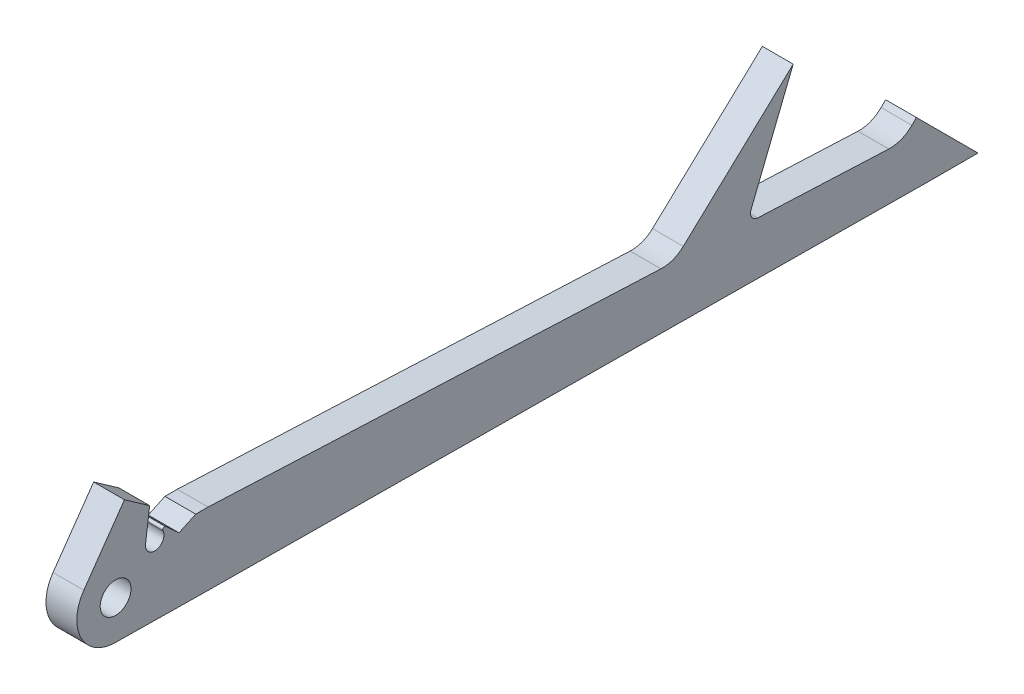
ISO-10303-21;
HEADER;
FILE_DESCRIPTION(('STEP AP214'),'2;1');
FILE_NAME('part.step','',(''),(''),'','','');
FILE_SCHEMA(('AUTOMOTIVE_DESIGN { 1 0 10303 214 1 1 1 1 }'));
ENDSEC;
DATA;
#1=APPLICATION_CONTEXT('core data for automotive mechanical design processes');
#2=APPLICATION_PROTOCOL_DEFINITION('international standard','automotive_design',2000,#1);
#3=PRODUCT_CONTEXT('',#1,'mechanical');
#4=PRODUCT('Part','Part','',(#3));
#5=PRODUCT_RELATED_PRODUCT_CATEGORY('part','',(#4));
#6=PRODUCT_DEFINITION_FORMATION('','',#4);
#7=PRODUCT_DEFINITION_CONTEXT('part definition',#1,'design');
#8=PRODUCT_DEFINITION('design','',#6,#7);
#9=PRODUCT_DEFINITION_SHAPE('','',#8);
#10=(LENGTH_UNIT() NAMED_UNIT(*) SI_UNIT(.MILLI.,.METRE.));
#11=(NAMED_UNIT(*) PLANE_ANGLE_UNIT() SI_UNIT($,.RADIAN.));
#12=(NAMED_UNIT(*) SI_UNIT($,.STERADIAN.) SOLID_ANGLE_UNIT());
#13=UNCERTAINTY_MEASURE_WITH_UNIT(LENGTH_MEASURE(1.E-05),#10,'distance_accuracy_value','');
#14=(GEOMETRIC_REPRESENTATION_CONTEXT(3) GLOBAL_UNCERTAINTY_ASSIGNED_CONTEXT((#13)) GLOBAL_UNIT_ASSIGNED_CONTEXT((#10,
#11,#12)) REPRESENTATION_CONTEXT('',''));
#15=CARTESIAN_POINT('',(0.,0.,0.));
#16=DIRECTION('',(0.,0.,1.));
#17=DIRECTION('',(1.,0.,0.));
#18=AXIS2_PLACEMENT_3D('',#15,#16,#17);
#19=CARTESIAN_POINT('',(-165.92089508835,16.1650258056597,-195.52164647412));
#20=DIRECTION('',(0.,0.999011487799349,-0.0444527529510865));
#21=DIRECTION('',(0.,0.0444527529510865,0.99901148779935));
#22=AXIS2_PLACEMENT_3D('',#19,#20,#21);
#23=PLANE('',#22);
#24=DIRECTION('',(0.,0.0444527529510865,0.99901148779935));
#25=VECTOR('',#24,1.);
#26=CARTESIAN_POINT('',(6.35,16.1650258056597,-195.52164647412));
#27=LINE('',#26,#25);
#28=CARTESIAN_POINT('',(6.35,12.0102324927861,-288.894631799908));
#29=VERTEX_POINT('',#28);
#30=CARTESIAN_POINT('',(6.35,16.1650258056597,-195.52164647412));
#31=VERTEX_POINT('',#30);
#32=EDGE_CURVE('E271',#29,#31,#27,.T.);
#33=ORIENTED_EDGE('',*,*,#32,.F.);
#34=DIRECTION('',(1.,0.,0.));
#35=VECTOR('',#34,1.);
#36=CARTESIAN_POINT('',(0.,12.0102324927861,-288.894631799908));
#37=LINE('',#36,#35);
#38=CARTESIAN_POINT('',(0.,12.0102324927861,-288.894631799908));
#39=VERTEX_POINT('',#38);
#40=EDGE_CURVE('E344',#29,#39,#37,.F.);
#41=ORIENTED_EDGE('',*,*,#40,.T.);
#42=DIRECTION('',(0.,-0.0444527529510865,-0.99901148779935));
#43=VECTOR('',#42,1.);
#44=CARTESIAN_POINT('',(0.,16.1650258056597,-195.52164647412));
#45=LINE('',#44,#43);
#46=CARTESIAN_POINT('',(0.,16.1650258056597,-195.52164647412));
#47=VERTEX_POINT('',#46);
#48=EDGE_CURVE('E226',#47,#39,#45,.T.);
#49=ORIENTED_EDGE('',*,*,#48,.F.);
#50=DIRECTION('',(-1.,0.,0.));
#51=VECTOR('',#50,1.);
#52=CARTESIAN_POINT('',(6.35,16.1650258056597,-195.52164647412));
#53=LINE('',#52,#51);
#54=EDGE_CURVE('E324',#31,#47,#53,.T.);
#55=ORIENTED_EDGE('',*,*,#54,.F.);
#56=EDGE_LOOP('',(#33,#41,#49,#55));
#57=FACE_BOUND('',#56,.T.);
#58=ADVANCED_FACE('F41',(#57),#23,.T.);
#59=CARTESIAN_POINT('',(6.35,9.525,-176.47164647412));
#60=DIRECTION('',(1.,0.,0.));
#61=DIRECTION('',(0.,0.,-1.));
#62=AXIS2_PLACEMENT_3D('',#59,#60,#61);
#63=PLANE('',#62);
#64=DIRECTION('',(0.,0.675997213115544,0.736904178207735));
#65=VECTOR('',#64,1.);
#66=CARTESIAN_POINT('',(6.35,14.554850228429,-189.540378321137));
#67=LINE('',#66,#65);
#68=CARTESIAN_POINT('',(6.35,14.554850228429,-189.540378321137));
#69=VERTEX_POINT('',#68);
#70=CARTESIAN_POINT('',(6.35,17.0473052344062,-186.823354534258));
#71=VERTEX_POINT('',#70);
#72=EDGE_CURVE('E290',#69,#71,#67,.T.);
#73=ORIENTED_EDGE('',*,*,#72,.T.);
#74=CARTESIAN_POINT('',(6.35,16.766544742509,-186.565799596061));
#75=DIRECTION('',(1.,0.,0.));
#76=DIRECTION('',(0.,0.,-1.));
#77=AXIS2_PLACEMENT_3D('',#74,#75,#76);
#78=CIRCLE('',#77,0.381);
#79=CARTESIAN_POINT('',(6.35,16.6212011416771,-186.213611808514));
#80=VERTEX_POINT('',#79);
#81=EDGE_CURVE('E338',#71,#80,#78,.T.);
#82=ORIENTED_EDGE('',*,*,#81,.T.);
#83=DIRECTION('',(0.,-0.924377395136311,-0.381479267275442));
#84=VECTOR('',#83,1.);
#85=CARTESIAN_POINT('',(6.35,18.2069999283971,-185.559172006775));
#86=LINE('',#85,#84);
#87=CARTESIAN_POINT('',(6.35,16.4460609906625,-186.285890010935));
#88=VERTEX_POINT('',#87);
#89=EDGE_CURVE('E293',#80,#88,#86,.T.);
#90=ORIENTED_EDGE('',*,*,#89,.T.);
#91=CARTESIAN_POINT('',(6.35,15.7193429865027,-184.524951073201));
#92=DIRECTION('',(-1.,0.,0.));
#93=DIRECTION('',(0.,0.,1.));
#94=AXIS2_PLACEMENT_3D('',#91,#92,#93);
#95=CIRCLE('',#94,1.90499999999998);
#96=CARTESIAN_POINT('',(6.35,15.9704562023801,-182.636574216529));
#97=VERTEX_POINT('',#96);
#98=EDGE_CURVE('E295',#88,#97,#95,.T.);
#99=ORIENTED_EDGE('',*,*,#98,.T.);
#100=DIRECTION('',(0.,0.991273940509858,-0.131817961090505));
#101=VECTOR('',#100,1.);
#102=CARTESIAN_POINT('',(6.35,15.9704562023801,-182.636574216529));
#103=LINE('',#102,#101);
#104=CARTESIAN_POINT('',(6.35,22.4356903032563,-183.496310301906));
#105=VERTEX_POINT('',#104);
#106=EDGE_CURVE('E297',#97,#105,#103,.T.);
#107=ORIENTED_EDGE('',*,*,#106,.T.);
#108=DIRECTION('',(0.,0.573576436351047,0.819152044288991));
#109=VECTOR('',#108,1.);
#110=CARTESIAN_POINT('',(6.35,26.0779006740854,-178.294694820671));
#111=LINE('',#110,#109);
#112=CARTESIAN_POINT('',(6.35,26.0779006740854,-178.294694820671));
#113=VERTEX_POINT('',#112);
#114=EDGE_CURVE('E299',#105,#113,#111,.T.);
#115=ORIENTED_EDGE('',*,*,#114,.T.);
#116=DIRECTION('',(0.,-0.819152044288991,0.573576436351048));
#117=VECTOR('',#116,1.);
#118=CARTESIAN_POINT('',(6.35,14.1141850672447,-169.917610967764));
#119=LINE('',#118,#117);
#120=CARTESIAN_POINT('',(6.35,14.1141850672447,-169.917610967764));
#121=VERTEX_POINT('',#120);
#122=EDGE_CURVE('E301',#113,#121,#119,.T.);
#123=ORIENTED_EDGE('',*,*,#122,.T.);
#124=CARTESIAN_POINT('',(6.35,9.525,-176.47164647412));
#125=DIRECTION('',(1.,0.,0.));
#126=DIRECTION('',(0.,0.,-1.));
#127=AXIS2_PLACEMENT_3D('',#124,#125,#126);
#128=CIRCLE('',#127,8.00100000000001);
#129=CARTESIAN_POINT('',(6.35,1.52470715135464,-176.365272906379));
#130=VERTEX_POINT('',#129);
#131=EDGE_CURVE('E281',#121,#130,#128,.T.);
#132=ORIENTED_EDGE('',*,*,#131,.T.);
#133=DIRECTION('',(0.,-0.0132950340883751,-0.999911617128528));
#134=VECTOR('',#133,1.);
#135=CARTESIAN_POINT('',(6.35,1.27000000001228,-195.521646474134));
#136=LINE('',#135,#134);
#137=CARTESIAN_POINT('',(6.35,1.27000000001228,-195.521646474134));
#138=VERTEX_POINT('',#137);
#139=EDGE_CURVE('E284',#130,#138,#136,.T.);
#140=ORIENTED_EDGE('',*,*,#139,.T.);
#141=DIRECTION('',(0.,-0.00851033009774635,-0.999963786485104));
#142=VECTOR('',#141,1.);
#143=CARTESIAN_POINT('',(6.35,1.27000000001228,-195.521646474134));
#144=LINE('',#143,#142);
#145=CARTESIAN_POINT('',(6.35,1.22755538373154E-11,-344.74664647412));
#146=VERTEX_POINT('',#145);
#147=EDGE_CURVE('E263',#138,#146,#144,.T.);
#148=ORIENTED_EDGE('',*,*,#147,.T.);
#149=DIRECTION('',(0.,0.,-1.));
#150=VECTOR('',#149,1.);
#151=CARTESIAN_POINT('',(6.35,1.22755538373154E-11,-344.74664647412));
#152=LINE('',#151,#150);
#153=CARTESIAN_POINT('',(6.35,1.22755538373154E-11,-354.27164647412));
#154=VERTEX_POINT('',#153);
#155=EDGE_CURVE('E266',#146,#154,#152,.T.);
#156=ORIENTED_EDGE('',*,*,#155,.T.);
#157=DIRECTION('',(0.,0.707106781186547,0.707106781186548));
#158=VECTOR('',#157,1.);
#159=CARTESIAN_POINT('',(6.35,9.52500000001227,-344.74664647412));
#160=LINE('',#159,#158);
#161=CARTESIAN_POINT('',(6.35,12.7000000000123,-341.57164647412));
#162=VERTEX_POINT('',#161);
#163=EDGE_CURVE('E269',#154,#162,#160,.T.);
#164=ORIENTED_EDGE('',*,*,#163,.T.);
#165=DIRECTION('',(0.,-0.707106781186549,0.707106781186546));
#166=VECTOR('',#165,1.);
#167=CARTESIAN_POINT('',(6.35,12.7000000000123,-341.57164647412));
#168=LINE('',#167,#166);
#169=CARTESIAN_POINT('',(6.35,11.7734565631059,-340.645103037214));
#170=VERTEX_POINT('',#169);
#171=EDGE_CURVE('E212',#162,#170,#168,.T.);
#172=ORIENTED_EDGE('',*,*,#171,.T.);
#173=CARTESIAN_POINT('',(6.35,16.2635846236405,-336.15497497668));
#174=DIRECTION('',(1.,0.,0.));
#175=DIRECTION('',(0.,0.,-1.));
#176=AXIS2_PLACEMENT_3D('',#173,#174,#175);
#177=CIRCLE('',#176,6.35);
#178=CARTESIAN_POINT('',(6.35,9.91986167611461,-335.87269999544));
#179=VERTEX_POINT('',#178);
#180=EDGE_CURVE('E355',#170,#179,#177,.F.);
#181=ORIENTED_EDGE('',*,*,#180,.T.);
#182=CARTESIAN_POINT('',(6.35,11.1207621842455,-308.884193689724));
#183=VERTEX_POINT('',#182);
#184=EDGE_CURVE('E272',#179,#183,#27,.T.);
#185=ORIENTED_EDGE('',*,*,#184,.T.);
#186=CARTESIAN_POINT('',(6.34999999999999,12.706692921127,-308.954762435033));
#187=DIRECTION('',(1.,0.,0.));
#188=DIRECTION('',(0.,0.,-1.));
#189=AXIS2_PLACEMENT_3D('',#186,#187,#188);
#190=CIRCLE('',#189,1.5875);
#191=CARTESIAN_POINT('',(6.35,13.2985853757295,-307.481731691232));
#192=VERTEX_POINT('',#191);
#193=EDGE_CURVE('E49',#183,#192,#190,.F.);
#194=ORIENTED_EDGE('',*,*,#193,.T.);
#195=DIRECTION('',(0.,0.927893381922255,-0.372845640694484));
#196=VECTOR('',#195,1.);
#197=CARTESIAN_POINT('',(6.35,11.2203257376244,-306.64664647412));
#198=LINE('',#197,#196);
#199=CARTESIAN_POINT('',(6.35,34.925,-316.17164647412));
#200=VERTEX_POINT('',#199);
#201=EDGE_CURVE('E211',#192,#200,#198,.T.);
#202=ORIENTED_EDGE('',*,*,#201,.T.);
#203=DIRECTION('',(0.,-0.683385621008016,0.730057595672758));
#204=VECTOR('',#203,1.);
#205=CARTESIAN_POINT('',(6.35,34.925,-316.17164647412));
#206=LINE('',#205,#204);
#207=CARTESIAN_POINT('',(6.35,13.7180897077899,-293.516405474548));
#208=VERTEX_POINT('',#207);
#209=EDGE_CURVE('E205',#200,#208,#206,.T.);
#210=ORIENTED_EDGE('',*,*,#209,.T.);
#211=CARTESIAN_POINT('',(6.35,18.3539554403119,-289.176906781148));
#212=DIRECTION('',(1.,0.,0.));
#213=DIRECTION('',(0.,0.,-1.));
#214=AXIS2_PLACEMENT_3D('',#211,#212,#213);
#215=CIRCLE('',#214,6.35);
#216=EDGE_CURVE('E352',#208,#29,#215,.F.);
#217=ORIENTED_EDGE('',*,*,#216,.T.);
#218=ORIENTED_EDGE('',*,*,#32,.T.);
#219=DIRECTION('',(0.,5.50284273886857E-13,1.));
#220=VECTOR('',#219,1.);
#221=CARTESIAN_POINT('',(6.35,16.1650258056611,-192.993410989747));
#222=LINE('',#221,#220);
#223=CARTESIAN_POINT('',(6.35,16.1650258056611,-192.993410989747));
#224=VERTEX_POINT('',#223);
#225=EDGE_CURVE('E286',#31,#224,#222,.T.);
#226=ORIENTED_EDGE('',*,*,#225,.T.);
#227=DIRECTION('',(0.,-0.422618261740698,0.90630778703665));
#228=VECTOR('',#227,1.);
#229=CARTESIAN_POINT('',(6.35,14.8232128246343,-190.115883765906));
#230=LINE('',#229,#228);
#231=EDGE_CURVE('E288',#224,#69,#230,.T.);
#232=ORIENTED_EDGE('',*,*,#231,.T.);
#233=EDGE_LOOP('',(#73,#82,#90,#99,#107,#115,#123,#132,#140,#148,#156,#164,#172,#181,#185,#194,
#202,#210,#217,#218,#226,#232));
#234=FACE_BOUND('',#233,.T.);
#235=CARTESIAN_POINT('',(6.35,9.525,-176.47164647412));
#236=DIRECTION('',(1.,0.,0.));
#237=DIRECTION('',(0.,0.,-1.));
#238=AXIS2_PLACEMENT_3D('',#235,#236,#237);
#239=CIRCLE('',#238,3.17499999999995);
#240=CARTESIAN_POINT('',(6.35,9.525,-179.64664647412));
#241=VERTEX_POINT('',#240);
#242=EDGE_CURVE('E277',#241,#241,#239,.T.);
#243=ORIENTED_EDGE('',*,*,#242,.F.);
#244=EDGE_LOOP('',(#243));
#245=FACE_BOUND('',#244,.T.);
#246=ADVANCED_FACE('F369',(#234,#245),#63,.T.);
#247=CARTESIAN_POINT('',(6.35,9.525,-176.47164647412));
#248=DIRECTION('',(-1.,0.,0.));
#249=DIRECTION('',(0.,0.,1.));
#250=AXIS2_PLACEMENT_3D('',#247,#248,#249);
#251=CYLINDRICAL_SURFACE('',#250,8.00100000000001);
#252=DIRECTION('',(-1.,0.,0.));
#253=VECTOR('',#252,1.);
#254=CARTESIAN_POINT('',(6.35,14.1141850672447,-169.917610967764));
#255=LINE('',#254,#253);
#256=CARTESIAN_POINT('',(0.,14.1141850672447,-169.917610967764));
#257=VERTEX_POINT('',#256);
#258=EDGE_CURVE('E303',#121,#257,#255,.T.);
#259=ORIENTED_EDGE('',*,*,#258,.T.);
#260=CARTESIAN_POINT('',(0.,9.525,-176.47164647412));
#261=DIRECTION('',(1.,0.,0.));
#262=DIRECTION('',(0.,0.,-1.));
#263=AXIS2_PLACEMENT_3D('',#260,#261,#262);
#264=CIRCLE('',#263,8.00100000000001);
#265=CARTESIAN_POINT('',(0.,1.52470715135464,-176.365272906379));
#266=VERTEX_POINT('',#265);
#267=EDGE_CURVE('E234',#257,#266,#264,.T.);
#268=ORIENTED_EDGE('',*,*,#267,.T.);
#269=DIRECTION('',(-1.,0.,0.));
#270=VECTOR('',#269,1.);
#271=CARTESIAN_POINT('',(6.35,1.52470715135464,-176.365272906379));
#272=LINE('',#271,#270);
#273=EDGE_CURVE('E330',#130,#266,#272,.T.);
#274=ORIENTED_EDGE('',*,*,#273,.F.);
#275=ORIENTED_EDGE('',*,*,#131,.F.);
#276=EDGE_LOOP('',(#259,#268,#274,#275));
#277=FACE_BOUND('',#276,.T.);
#278=ADVANCED_FACE('F399',(#277),#251,.T.);
#279=CARTESIAN_POINT('',(6.35,1.27000000001228,-195.521646474134));
#280=DIRECTION('',(0.,0.999911617128528,-0.0132950340883751));
#281=DIRECTION('',(0.,0.0132950340883751,0.999911617128528));
#282=AXIS2_PLACEMENT_3D('',#279,#280,#281);
#283=PLANE('',#282);
#284=ORIENTED_EDGE('',*,*,#273,.T.);
#285=DIRECTION('',(0.,-0.0132950340883751,-0.999911617128528));
#286=VECTOR('',#285,1.);
#287=CARTESIAN_POINT('',(0.,1.27000000001228,-195.521646474134));
#288=LINE('',#287,#286);
#289=CARTESIAN_POINT('',(0.,1.27000000001228,-195.521646474134));
#290=VERTEX_POINT('',#289);
#291=EDGE_CURVE('E231',#266,#290,#288,.T.);
#292=ORIENTED_EDGE('',*,*,#291,.T.);
#293=DIRECTION('',(-1.,0.,0.));
#294=VECTOR('',#293,1.);
#295=CARTESIAN_POINT('',(6.35,1.27000000001228,-195.521646474134));
#296=LINE('',#295,#294);
#297=EDGE_CURVE('E327',#138,#290,#296,.T.);
#298=ORIENTED_EDGE('',*,*,#297,.F.);
#299=ORIENTED_EDGE('',*,*,#139,.F.);
#300=EDGE_LOOP('',(#284,#292,#298,#299));
#301=FACE_BOUND('',#300,.T.);
#302=ADVANCED_FACE('F396',(#301),#283,.F.);
#303=CARTESIAN_POINT('',(6.35,16.1650258056611,-192.993410989747));
#304=DIRECTION('',(0.,-1.,5.50284273886857E-13));
#305=DIRECTION('',(0.,-5.50284273886857E-13,-1.));
#306=AXIS2_PLACEMENT_3D('',#303,#304,#305);
#307=PLANE('',#306);
#308=ORIENTED_EDGE('',*,*,#54,.T.);
#309=DIRECTION('',(0.,5.50284273886857E-13,1.));
#310=VECTOR('',#309,1.);
#311=CARTESIAN_POINT('',(0.,16.1650258056611,-192.993410989747));
#312=LINE('',#311,#310);
#313=CARTESIAN_POINT('',(0.,16.1650258056611,-192.993410989747));
#314=VERTEX_POINT('',#313);
#315=EDGE_CURVE('E228',#47,#314,#312,.T.);
#316=ORIENTED_EDGE('',*,*,#315,.T.);
#317=DIRECTION('',(-1.,0.,0.));
#318=VECTOR('',#317,1.);
#319=CARTESIAN_POINT('',(6.35,16.1650258056611,-192.993410989747));
#320=LINE('',#319,#318);
#321=EDGE_CURVE('E321',#224,#314,#320,.T.);
#322=ORIENTED_EDGE('',*,*,#321,.F.);
#323=ORIENTED_EDGE('',*,*,#225,.F.);
#324=EDGE_LOOP('',(#308,#316,#322,#323));
#325=FACE_BOUND('',#324,.T.);
#326=ADVANCED_FACE('F438',(#325),#307,.F.);
#327=CARTESIAN_POINT('',(6.35,14.554850228429,-189.540378321137));
#328=DIRECTION('',(0.,-0.906307787036655,-0.422618261740688));
#329=DIRECTION('',(0.,0.422618261740688,-0.906307787036655));
#330=AXIS2_PLACEMENT_3D('',#327,#328,#329);
#331=PLANE('',#330);
#332=ORIENTED_EDGE('',*,*,#321,.T.);
#333=DIRECTION('',(0.,-0.422618261740688,0.906307787036655));
#334=VECTOR('',#333,1.);
#335=CARTESIAN_POINT('',(0.,14.554850228429,-189.540378321137));
#336=LINE('',#335,#334);
#337=CARTESIAN_POINT('',(0.,14.554850228429,-189.540378321137));
#338=VERTEX_POINT('',#337);
#339=EDGE_CURVE('E252',#314,#338,#336,.T.);
#340=ORIENTED_EDGE('',*,*,#339,.T.);
#341=DIRECTION('',(-1.,0.,0.));
#342=VECTOR('',#341,1.);
#343=CARTESIAN_POINT('',(6.35,14.554850228429,-189.540378321137));
#344=LINE('',#343,#342);
#345=EDGE_CURVE('E318',#69,#338,#344,.T.);
#346=ORIENTED_EDGE('',*,*,#345,.F.);
#347=ORIENTED_EDGE('',*,*,#231,.F.);
#348=EDGE_LOOP('',(#332,#340,#346,#347));
#349=FACE_BOUND('',#348,.T.);
#350=ADVANCED_FACE('F435',(#349),#331,.F.);
#351=CARTESIAN_POINT('',(6.35,14.554850228429,-189.540378321137));
#352=DIRECTION('',(0.,-0.736904178207735,0.675997213115544));
#353=DIRECTION('',(0.,-0.675997213115544,-0.736904178207735));
#354=AXIS2_PLACEMENT_3D('',#351,#352,#353);
#355=PLANE('',#354);
#356=ORIENTED_EDGE('',*,*,#345,.T.);
#357=DIRECTION('',(0.,0.675997213115544,0.736904178207735));
#358=VECTOR('',#357,1.);
#359=CARTESIAN_POINT('',(0.,14.554850228429,-189.540378321137));
#360=LINE('',#359,#358);
#361=CARTESIAN_POINT('',(0.,17.0473052344062,-186.823354534258));
#362=VERTEX_POINT('',#361);
#363=EDGE_CURVE('E257',#338,#362,#360,.T.);
#364=ORIENTED_EDGE('',*,*,#363,.T.);
#365=DIRECTION('',(-1.,0.,0.));
#366=VECTOR('',#365,1.);
#367=CARTESIAN_POINT('',(6.35,17.0473052344062,-186.823354534258));
#368=LINE('',#367,#366);
#369=EDGE_CURVE('E336',#362,#71,#368,.F.);
#370=ORIENTED_EDGE('',*,*,#369,.T.);
#371=ORIENTED_EDGE('',*,*,#72,.F.);
#372=EDGE_LOOP('',(#356,#364,#370,#371));
#373=FACE_BOUND('',#372,.T.);
#374=ADVANCED_FACE('F429',(#373),#355,.F.);
#375=CARTESIAN_POINT('',(6.35,18.2069999283971,-185.559172006775));
#376=DIRECTION('',(0.,0.381479267275442,-0.924377395136311));
#377=DIRECTION('',(0.,0.924377395136311,0.381479267275442));
#378=AXIS2_PLACEMENT_3D('',#375,#376,#377);
#379=PLANE('',#378);
#380=DIRECTION('',(-1.,0.,0.));
#381=VECTOR('',#380,1.);
#382=CARTESIAN_POINT('',(6.35,16.6212011416771,-186.213611808514));
#383=LINE('',#382,#381);
#384=CARTESIAN_POINT('',(0.,16.6212011416771,-186.213611808514));
#385=VERTEX_POINT('',#384);
#386=EDGE_CURVE('E333',#80,#385,#383,.T.);
#387=ORIENTED_EDGE('',*,*,#386,.T.);
#388=DIRECTION('',(0.,-0.924377395136311,-0.381479267275442));
#389=VECTOR('',#388,1.);
#390=CARTESIAN_POINT('',(0.,18.2069999283971,-185.559172006775));
#391=LINE('',#390,#389);
#392=CARTESIAN_POINT('',(0.,16.4460609906625,-186.285890010935));
#393=VERTEX_POINT('',#392);
#394=EDGE_CURVE('E249',#385,#393,#391,.T.);
#395=ORIENTED_EDGE('',*,*,#394,.T.);
#396=DIRECTION('',(-1.,0.,0.));
#397=VECTOR('',#396,1.);
#398=CARTESIAN_POINT('',(6.35,16.4460609906625,-186.285890010935));
#399=LINE('',#398,#397);
#400=EDGE_CURVE('E315',#88,#393,#399,.T.);
#401=ORIENTED_EDGE('',*,*,#400,.F.);
#402=ORIENTED_EDGE('',*,*,#89,.F.);
#403=EDGE_LOOP('',(#387,#395,#401,#402));
#404=FACE_BOUND('',#403,.T.);
#405=ADVANCED_FACE('F420',(#404),#379,.F.);
#406=CARTESIAN_POINT('',(6.35,15.7193429865027,-184.524951073201));
#407=DIRECTION('',(-1.,0.,0.));
#408=DIRECTION('',(0.,0.,1.));
#409=AXIS2_PLACEMENT_3D('',#406,#407,#408);
#410=CYLINDRICAL_SURFACE('',#409,1.90499999999998);
#411=ORIENTED_EDGE('',*,*,#400,.T.);
#412=CARTESIAN_POINT('',(0.,15.7193429865027,-184.524951073201));
#413=DIRECTION('',(1.,0.,0.));
#414=DIRECTION('',(0.,0.,-1.));
#415=AXIS2_PLACEMENT_3D('',#412,#413,#414);
#416=CIRCLE('',#415,1.90499999999998);
#417=CARTESIAN_POINT('',(0.,15.9704562023801,-182.636574216529));
#418=VERTEX_POINT('',#417);
#419=EDGE_CURVE('E246',#393,#418,#416,.F.);
#420=ORIENTED_EDGE('',*,*,#419,.T.);
#421=DIRECTION('',(-1.,0.,0.));
#422=VECTOR('',#421,1.);
#423=CARTESIAN_POINT('',(6.35,15.9704562023801,-182.636574216529));
#424=LINE('',#423,#422);
#425=EDGE_CURVE('E312',#97,#418,#424,.T.);
#426=ORIENTED_EDGE('',*,*,#425,.F.);
#427=ORIENTED_EDGE('',*,*,#98,.F.);
#428=EDGE_LOOP('',(#411,#420,#426,#427));
#429=FACE_BOUND('',#428,.T.);
#430=ADVANCED_FACE('F415',(#429),#410,.F.);
#431=CARTESIAN_POINT('',(6.35,15.9704562023801,-182.636574216529));
#432=DIRECTION('',(0.,0.131817961090505,0.991273940509858));
#433=DIRECTION('',(0.,-0.991273940509858,0.131817961090505));
#434=AXIS2_PLACEMENT_3D('',#431,#432,#433);
#435=PLANE('',#434);
#436=ORIENTED_EDGE('',*,*,#425,.T.);
#437=DIRECTION('',(0.,0.991273940509858,-0.131817961090505));
#438=VECTOR('',#437,1.);
#439=CARTESIAN_POINT('',(0.,15.9704562023801,-182.636574216529));
#440=LINE('',#439,#438);
#441=CARTESIAN_POINT('',(0.,22.4356903032563,-183.496310301906));
#442=VERTEX_POINT('',#441);
#443=EDGE_CURVE('E243',#418,#442,#440,.T.);
#444=ORIENTED_EDGE('',*,*,#443,.T.);
#445=DIRECTION('',(-1.,0.,0.));
#446=VECTOR('',#445,1.);
#447=CARTESIAN_POINT('',(6.35,22.4356903032563,-183.496310301906));
#448=LINE('',#447,#446);
#449=EDGE_CURVE('E309',#105,#442,#448,.T.);
#450=ORIENTED_EDGE('',*,*,#449,.F.);
#451=ORIENTED_EDGE('',*,*,#106,.F.);
#452=EDGE_LOOP('',(#436,#444,#450,#451));
#453=FACE_BOUND('',#452,.T.);
#454=ADVANCED_FACE('F412',(#453),#435,.F.);
#455=CARTESIAN_POINT('',(6.35,26.0779006740854,-178.294694820671));
#456=DIRECTION('',(0.,-0.819152044288991,0.573576436351047));
#457=DIRECTION('',(0.,-0.573576436351047,-0.819152044288991));
#458=AXIS2_PLACEMENT_3D('',#455,#456,#457);
#459=PLANE('',#458);
#460=ORIENTED_EDGE('',*,*,#449,.T.);
#461=DIRECTION('',(0.,0.573576436351047,0.819152044288991));
#462=VECTOR('',#461,1.);
#463=CARTESIAN_POINT('',(0.,26.0779006740854,-178.294694820671));
#464=LINE('',#463,#462);
#465=CARTESIAN_POINT('',(0.,26.0779006740854,-178.294694820671));
#466=VERTEX_POINT('',#465);
#467=EDGE_CURVE('E240',#442,#466,#464,.T.);
#468=ORIENTED_EDGE('',*,*,#467,.T.);
#469=DIRECTION('',(-1.,0.,0.));
#470=VECTOR('',#469,1.);
#471=CARTESIAN_POINT('',(6.35,26.0779006740854,-178.294694820671));
#472=LINE('',#471,#470);
#473=EDGE_CURVE('E306',#113,#466,#472,.T.);
#474=ORIENTED_EDGE('',*,*,#473,.F.);
#475=ORIENTED_EDGE('',*,*,#114,.F.);
#476=EDGE_LOOP('',(#460,#468,#474,#475));
#477=FACE_BOUND('',#476,.T.);
#478=ADVANCED_FACE('F407',(#477),#459,.F.);
#479=CARTESIAN_POINT('',(6.35,14.1141850672447,-169.917610967764));
#480=DIRECTION('',(0.,-0.573576436351048,-0.819152044288991));
#481=DIRECTION('',(0.,0.819152044288991,-0.573576436351048));
#482=AXIS2_PLACEMENT_3D('',#479,#480,#481);
#483=PLANE('',#482);
#484=ORIENTED_EDGE('',*,*,#473,.T.);
#485=DIRECTION('',(0.,-0.819152044288991,0.573576436351048));
#486=VECTOR('',#485,1.);
#487=CARTESIAN_POINT('',(0.,14.1141850672447,-169.917610967764));
#488=LINE('',#487,#486);
#489=EDGE_CURVE('E237',#466,#257,#488,.T.);
#490=ORIENTED_EDGE('',*,*,#489,.T.);
#491=ORIENTED_EDGE('',*,*,#258,.F.);
#492=ORIENTED_EDGE('',*,*,#122,.F.);
#493=EDGE_LOOP('',(#484,#490,#491,#492));
#494=FACE_BOUND('',#493,.T.);
#495=ADVANCED_FACE('F404',(#494),#483,.F.);
#496=CARTESIAN_POINT('',(6.35,9.525,-176.47164647412));
#497=DIRECTION('',(-1.,0.,0.));
#498=DIRECTION('',(0.,0.,1.));
#499=AXIS2_PLACEMENT_3D('',#496,#497,#498);
#500=CYLINDRICAL_SURFACE('',#499,3.17499999999995);
#501=CARTESIAN_POINT('',(0.,9.525,-176.47164647412));
#502=DIRECTION('',(1.,0.,0.));
#503=DIRECTION('',(0.,0.,-1.));
#504=AXIS2_PLACEMENT_3D('',#501,#502,#503);
#505=CIRCLE('',#504,3.17499999999995);
#506=CARTESIAN_POINT('',(0.,9.525,-179.64664647412));
#507=VERTEX_POINT('',#506);
#508=EDGE_CURVE('E260',#507,#507,#505,.T.);
#509=ORIENTED_EDGE('',*,*,#508,.F.);
#510=EDGE_LOOP('',(#509));
#511=FACE_BOUND('',#510,.T.);
#512=ORIENTED_EDGE('',*,*,#242,.T.);
#513=EDGE_LOOP('',(#512));
#514=FACE_BOUND('',#513,.T.);
#515=ADVANCED_FACE('F462',(#511,#514),#500,.F.);
#516=CARTESIAN_POINT('',(6.35,16.766544742509,-186.565799596061));
#517=DIRECTION('',(-1.,0.,0.));
#518=DIRECTION('',(0.,0.,1.));
#519=AXIS2_PLACEMENT_3D('',#516,#517,#518);
#520=CYLINDRICAL_SURFACE('',#519,0.381);
#521=CARTESIAN_POINT('',(0.,16.766544742509,-186.565799596061));
#522=DIRECTION('',(1.,0.,0.));
#523=DIRECTION('',(0.,0.,-1.));
#524=AXIS2_PLACEMENT_3D('',#521,#522,#523);
#525=CIRCLE('',#524,0.381);
#526=EDGE_CURVE('E255',#385,#362,#525,.F.);
#527=ORIENTED_EDGE('',*,*,#526,.F.);
#528=ORIENTED_EDGE('',*,*,#386,.F.);
#529=ORIENTED_EDGE('',*,*,#81,.F.);
#530=ORIENTED_EDGE('',*,*,#369,.F.);
#531=EDGE_LOOP('',(#527,#528,#529,#530));
#532=FACE_BOUND('',#531,.T.);
#533=ADVANCED_FACE('F425',(#532),#520,.T.);
#534=CARTESIAN_POINT('',(0.,11.1207621842455,-308.884193689724));
#535=VERTEX_POINT('',#534);
#536=CARTESIAN_POINT('',(0.,9.91986167611461,-335.87269999544));
#537=VERTEX_POINT('',#536);
#538=EDGE_CURVE('E225',#535,#537,#45,.T.);
#539=ORIENTED_EDGE('',*,*,#538,.F.);
#540=DIRECTION('',(1.,0.,0.));
#541=VECTOR('',#540,1.);
#542=CARTESIAN_POINT('',(6.34999999999994,11.1207621842455,-308.884193689724));
#543=LINE('',#542,#541);
#544=EDGE_CURVE('E359',#535,#183,#543,.T.);
#545=ORIENTED_EDGE('',*,*,#544,.T.);
#546=ORIENTED_EDGE('',*,*,#184,.F.);
#547=DIRECTION('',(1.,0.,0.));
#548=VECTOR('',#547,1.);
#549=CARTESIAN_POINT('',(0.,9.91986167611461,-335.87269999544));
#550=LINE('',#549,#548);
#551=EDGE_CURVE('E349',#179,#537,#550,.F.);
#552=ORIENTED_EDGE('',*,*,#551,.T.);
#553=EDGE_LOOP('',(#539,#545,#546,#552));
#554=FACE_BOUND('',#553,.T.);
#555=ADVANCED_FACE('F366',(#554),#23,.T.);
#556=CARTESIAN_POINT('',(-165.92089508835,9.52500000001227,-344.74664647412));
#557=DIRECTION('',(0.,0.707106781186548,-0.707106781186547));
#558=DIRECTION('',(0.,0.707106781186547,0.707106781186548));
#559=AXIS2_PLACEMENT_3D('',#556,#557,#558);
#560=PLANE('',#559);
#561=DIRECTION('',(0.,-0.707106781186547,-0.707106781186548));
#562=VECTOR('',#561,1.);
#563=CARTESIAN_POINT('',(0.,9.52500000001227,-344.74664647412));
#564=LINE('',#563,#562);
#565=CARTESIAN_POINT('',(0.,12.7000000000123,-341.57164647412));
#566=VERTEX_POINT('',#565);
#567=CARTESIAN_POINT('',(0.,1.22749033160119E-11,-354.27164647412));
#568=VERTEX_POINT('',#567);
#569=EDGE_CURVE('E223',#566,#568,#564,.T.);
#570=ORIENTED_EDGE('',*,*,#569,.F.);
#571=DIRECTION('',(1.,0.,0.));
#572=VECTOR('',#571,1.);
#573=CARTESIAN_POINT('',(-34.1672349589112,12.7000000000123,-341.57164647412));
#574=LINE('',#573,#572);
#575=EDGE_CURVE('E217',#566,#162,#574,.T.);
#576=ORIENTED_EDGE('',*,*,#575,.T.);
#577=ORIENTED_EDGE('',*,*,#163,.F.);
#578=DIRECTION('',(1.,0.,0.));
#579=VECTOR('',#578,1.);
#580=CARTESIAN_POINT('',(-165.92089508835,1.22755538373154E-11,-354.27164647412));
#581=LINE('',#580,#579);
#582=EDGE_CURVE('E275',#568,#154,#581,.T.);
#583=ORIENTED_EDGE('',*,*,#582,.F.);
#584=EDGE_LOOP('',(#570,#576,#577,#583));
#585=FACE_BOUND('',#584,.T.);
#586=ADVANCED_FACE('F384',(#585),#560,.T.);
#587=CARTESIAN_POINT('',(-165.92089508835,1.22755538373154E-11,-344.74664647412));
#588=DIRECTION('',(0.,-1.,0.));
#589=DIRECTION('',(0.,0.,-1.));
#590=AXIS2_PLACEMENT_3D('',#587,#588,#589);
#591=PLANE('',#590);
#592=DIRECTION('',(0.,0.,1.));
#593=VECTOR('',#592,1.);
#594=CARTESIAN_POINT('',(0.,1.22755538373154E-11,-344.74664647412));
#595=LINE('',#594,#593);
#596=CARTESIAN_POINT('',(0.,1.22755538373154E-11,-344.74664647412));
#597=VERTEX_POINT('',#596);
#598=EDGE_CURVE('E216',#568,#597,#595,.T.);
#599=ORIENTED_EDGE('',*,*,#598,.F.);
#600=ORIENTED_EDGE('',*,*,#582,.T.);
#601=ORIENTED_EDGE('',*,*,#155,.F.);
#602=DIRECTION('',(1.,0.,0.));
#603=VECTOR('',#602,1.);
#604=CARTESIAN_POINT('',(-165.92089508835,1.22755538373154E-11,-344.74664647412));
#605=LINE('',#604,#603);
#606=EDGE_CURVE('E274',#597,#146,#605,.T.);
#607=ORIENTED_EDGE('',*,*,#606,.F.);
#608=EDGE_LOOP('',(#599,#600,#601,#607));
#609=FACE_BOUND('',#608,.T.);
#610=ADVANCED_FACE('F388',(#609),#591,.T.);
#611=CARTESIAN_POINT('',(-165.92089508835,1.27000000001228,-195.521646474134));
#612=DIRECTION('',(0.,-0.999963786485104,0.00851033009774635));
#613=DIRECTION('',(0.,-0.00851033009774635,-0.999963786485104));
#614=AXIS2_PLACEMENT_3D('',#611,#612,#613);
#615=PLANE('',#614);
#616=DIRECTION('',(0.,0.00851033009774635,0.999963786485104));
#617=VECTOR('',#616,1.);
#618=CARTESIAN_POINT('',(0.,1.27000000001228,-195.521646474134));
#619=LINE('',#618,#617);
#620=EDGE_CURVE('E340',#597,#290,#619,.T.);
#621=ORIENTED_EDGE('',*,*,#620,.F.);
#622=ORIENTED_EDGE('',*,*,#606,.T.);
#623=ORIENTED_EDGE('',*,*,#147,.F.);
#624=ORIENTED_EDGE('',*,*,#297,.T.);
#625=EDGE_LOOP('',(#621,#622,#623,#624));
#626=FACE_BOUND('',#625,.T.);
#627=ADVANCED_FACE('F392',(#626),#615,.T.);
#628=CARTESIAN_POINT('',(0.,9.525,-176.47164647412));
#629=DIRECTION('',(1.,0.,0.));
#630=DIRECTION('',(0.,0.,-1.));
#631=AXIS2_PLACEMENT_3D('',#628,#629,#630);
#632=PLANE('',#631);
#633=ORIENTED_EDGE('',*,*,#508,.T.);
#634=EDGE_LOOP('',(#633));
#635=FACE_BOUND('',#634,.T.);
#636=ORIENTED_EDGE('',*,*,#339,.F.);
#637=ORIENTED_EDGE('',*,*,#315,.F.);
#638=ORIENTED_EDGE('',*,*,#48,.T.);
#639=CARTESIAN_POINT('',(0.,18.3539554403119,-289.176906781148));
#640=DIRECTION('',(1.,0.,0.));
#641=DIRECTION('',(0.,0.,-1.));
#642=AXIS2_PLACEMENT_3D('',#639,#640,#641);
#643=CIRCLE('',#642,6.35);
#644=CARTESIAN_POINT('',(0.,13.7180897077899,-293.516405474548));
#645=VERTEX_POINT('',#644);
#646=EDGE_CURVE('E195',#39,#645,#643,.T.);
#647=ORIENTED_EDGE('',*,*,#646,.T.);
#648=DIRECTION('',(0.,0.683385621008016,-0.730057595672758));
#649=VECTOR('',#648,1.);
#650=CARTESIAN_POINT('',(0.,34.925,-316.17164647412));
#651=LINE('',#650,#649);
#652=CARTESIAN_POINT('',(0.,34.925,-316.17164647412));
#653=VERTEX_POINT('',#652);
#654=EDGE_CURVE('E188',#645,#653,#651,.T.);
#655=ORIENTED_EDGE('',*,*,#654,.T.);
#656=DIRECTION('',(0.,-0.927893381922255,0.372845640694484));
#657=VECTOR('',#656,1.);
#658=CARTESIAN_POINT('',(0.,11.2203257376244,-306.64664647412));
#659=LINE('',#658,#657);
#660=CARTESIAN_POINT('',(0.,13.2985853757295,-307.481731691232));
#661=VERTEX_POINT('',#660);
#662=EDGE_CURVE('E191',#653,#661,#659,.T.);
#663=ORIENTED_EDGE('',*,*,#662,.T.);
#664=CARTESIAN_POINT('',(0.,12.706692921127,-308.954762435033));
#665=DIRECTION('',(1.,0.,0.));
#666=DIRECTION('',(0.,0.,-1.));
#667=AXIS2_PLACEMENT_3D('',#664,#665,#666);
#668=CIRCLE('',#667,1.5875);
#669=EDGE_CURVE('E12',#661,#535,#668,.T.);
#670=ORIENTED_EDGE('',*,*,#669,.T.);
#671=ORIENTED_EDGE('',*,*,#538,.T.);
#672=CARTESIAN_POINT('',(0.,16.2635846236405,-336.15497497668));
#673=DIRECTION('',(1.,0.,0.));
#674=DIRECTION('',(0.,0.,-1.));
#675=AXIS2_PLACEMENT_3D('',#672,#673,#674);
#676=CIRCLE('',#675,6.35);
#677=CARTESIAN_POINT('',(0.,11.7734565631059,-340.645103037214));
#678=VERTEX_POINT('',#677);
#679=EDGE_CURVE('E357',#537,#678,#676,.T.);
#680=ORIENTED_EDGE('',*,*,#679,.T.);
#681=DIRECTION('',(0.,0.707106781186549,-0.707106781186546));
#682=VECTOR('',#681,1.);
#683=CARTESIAN_POINT('',(0.,12.7000000000123,-341.57164647412));
#684=LINE('',#683,#682);
#685=EDGE_CURVE('E214',#678,#566,#684,.T.);
#686=ORIENTED_EDGE('',*,*,#685,.T.);
#687=ORIENTED_EDGE('',*,*,#569,.T.);
#688=ORIENTED_EDGE('',*,*,#598,.T.);
#689=ORIENTED_EDGE('',*,*,#620,.T.);
#690=ORIENTED_EDGE('',*,*,#291,.F.);
#691=ORIENTED_EDGE('',*,*,#267,.F.);
#692=ORIENTED_EDGE('',*,*,#489,.F.);
#693=ORIENTED_EDGE('',*,*,#467,.F.);
#694=ORIENTED_EDGE('',*,*,#443,.F.);
#695=ORIENTED_EDGE('',*,*,#419,.F.);
#696=ORIENTED_EDGE('',*,*,#394,.F.);
#697=ORIENTED_EDGE('',*,*,#526,.T.);
#698=ORIENTED_EDGE('',*,*,#363,.F.);
#699=EDGE_LOOP('',(#636,#637,#638,#647,#655,#663,#670,#671,#680,#686,#687,#688,#689,#690,#691,
#692,#693,#694,#695,#696,#697,#698));
#700=FACE_BOUND('',#699,.T.);
#701=ADVANCED_FACE('F190',(#635,#700),#632,.F.);
#702=CARTESIAN_POINT('',(-34.1672349589112,12.7000000000123,-341.57164647412));
#703=DIRECTION('',(0.,0.707106781186546,0.707106781186549));
#704=DIRECTION('',(0.,-0.707106781186549,0.707106781186546));
#705=AXIS2_PLACEMENT_3D('',#702,#703,#704);
#706=PLANE('',#705);
#707=ORIENTED_EDGE('',*,*,#685,.F.);
#708=DIRECTION('',(1.,0.,0.));
#709=VECTOR('',#708,1.);
#710=CARTESIAN_POINT('',(6.35,11.7734565631059,-340.645103037214));
#711=LINE('',#710,#709);
#712=EDGE_CURVE('E346',#678,#170,#711,.T.);
#713=ORIENTED_EDGE('',*,*,#712,.T.);
#714=ORIENTED_EDGE('',*,*,#171,.F.);
#715=ORIENTED_EDGE('',*,*,#575,.F.);
#716=EDGE_LOOP('',(#707,#713,#714,#715));
#717=FACE_BOUND('',#716,.T.);
#718=ADVANCED_FACE('F378',(#717),#706,.T.);
#719=CARTESIAN_POINT('',(-34.1672349589112,34.925,-316.17164647412));
#720=DIRECTION('',(0.,0.730057595672758,0.683385621008016));
#721=DIRECTION('',(0.,-0.683385621008016,0.730057595672758));
#722=AXIS2_PLACEMENT_3D('',#719,#720,#721);
#723=PLANE('',#722);
#724=ORIENTED_EDGE('',*,*,#654,.F.);
#725=DIRECTION('',(1.,0.,0.));
#726=VECTOR('',#725,1.);
#727=CARTESIAN_POINT('',(6.35,13.7180897077899,-293.516405474548));
#728=LINE('',#727,#726);
#729=EDGE_CURVE('E342',#645,#208,#728,.T.);
#730=ORIENTED_EDGE('',*,*,#729,.T.);
#731=ORIENTED_EDGE('',*,*,#209,.F.);
#732=DIRECTION('',(1.,0.,0.));
#733=VECTOR('',#732,1.);
#734=CARTESIAN_POINT('',(-34.1672349589112,34.925,-316.17164647412));
#735=LINE('',#734,#733);
#736=EDGE_CURVE('E199',#653,#200,#735,.T.);
#737=ORIENTED_EDGE('',*,*,#736,.F.);
#738=EDGE_LOOP('',(#724,#730,#731,#737));
#739=FACE_BOUND('',#738,.T.);
#740=ADVANCED_FACE('F203',(#739),#723,.T.);
#741=CARTESIAN_POINT('',(-34.1672349589112,11.2203257376244,-306.64664647412));
#742=DIRECTION('',(0.,-0.372845640694484,-0.927893381922255));
#743=DIRECTION('',(0.,0.927893381922255,-0.372845640694484));
#744=AXIS2_PLACEMENT_3D('',#741,#742,#743);
#745=PLANE('',#744);
#746=ORIENTED_EDGE('',*,*,#201,.F.);
#747=DIRECTION('',(1.,0.,0.));
#748=VECTOR('',#747,1.);
#749=CARTESIAN_POINT('',(0.,13.2985853757295,-307.481731691232));
#750=LINE('',#749,#748);
#751=EDGE_CURVE('E62',#192,#661,#750,.F.);
#752=ORIENTED_EDGE('',*,*,#751,.T.);
#753=ORIENTED_EDGE('',*,*,#662,.F.);
#754=ORIENTED_EDGE('',*,*,#736,.T.);
#755=EDGE_LOOP('',(#746,#752,#753,#754));
#756=FACE_BOUND('',#755,.T.);
#757=ADVANCED_FACE('F207',(#756),#745,.T.);
#758=CARTESIAN_POINT('',(-34.1672349589112,18.3539554403119,-289.176906781148));
#759=DIRECTION('',(-1.,0.,0.));
#760=DIRECTION('',(0.,0.,1.));
#761=AXIS2_PLACEMENT_3D('',#758,#759,#760);
#762=CYLINDRICAL_SURFACE('',#761,6.35);
#763=ORIENTED_EDGE('',*,*,#646,.F.);
#764=ORIENTED_EDGE('',*,*,#40,.F.);
#765=ORIENTED_EDGE('',*,*,#216,.F.);
#766=ORIENTED_EDGE('',*,*,#729,.F.);
#767=EDGE_LOOP('',(#763,#764,#765,#766));
#768=FACE_BOUND('',#767,.T.);
#769=ADVANCED_FACE('F444',(#768),#762,.F.);
#770=CARTESIAN_POINT('',(-34.1672349589112,16.2635846236405,-336.15497497668));
#771=DIRECTION('',(-1.,0.,0.));
#772=DIRECTION('',(0.,0.,1.));
#773=AXIS2_PLACEMENT_3D('',#770,#771,#772);
#774=CYLINDRICAL_SURFACE('',#773,6.35);
#775=ORIENTED_EDGE('',*,*,#679,.F.);
#776=ORIENTED_EDGE('',*,*,#551,.F.);
#777=ORIENTED_EDGE('',*,*,#180,.F.);
#778=ORIENTED_EDGE('',*,*,#712,.F.);
#779=EDGE_LOOP('',(#775,#776,#777,#778));
#780=FACE_BOUND('',#779,.T.);
#781=ADVANCED_FACE('F375',(#780),#774,.F.);
#782=CARTESIAN_POINT('',(-165.92089508835,12.706692921127,-308.954762435033));
#783=DIRECTION('',(-1.,0.,0.));
#784=DIRECTION('',(0.,0.,1.));
#785=AXIS2_PLACEMENT_3D('',#782,#783,#784);
#786=CYLINDRICAL_SURFACE('',#785,1.5875);
#787=ORIENTED_EDGE('',*,*,#669,.F.);
#788=ORIENTED_EDGE('',*,*,#751,.F.);
#789=ORIENTED_EDGE('',*,*,#193,.F.);
#790=ORIENTED_EDGE('',*,*,#544,.F.);
#791=EDGE_LOOP('',(#787,#788,#789,#790));
#792=FACE_BOUND('',#791,.T.);
#793=ADVANCED_FACE('F43',(#792),#786,.F.);
#794=CLOSED_SHELL('',(#58,#246,#278,#302,#326,#350,#374,#405,#430,#454,#478,#495,#515,#533,#555,
#586,#610,#627,#701,#718,#740,#757,#769,#781,#793));
#795=MANIFOLD_SOLID_BREP('B2',#794);
#796=ADVANCED_BREP_SHAPE_REPRESENTATION('',(#18,#795),#14);
#797=SHAPE_DEFINITION_REPRESENTATION(#9,#796);
ENDSEC;
END-ISO-10303-21;
